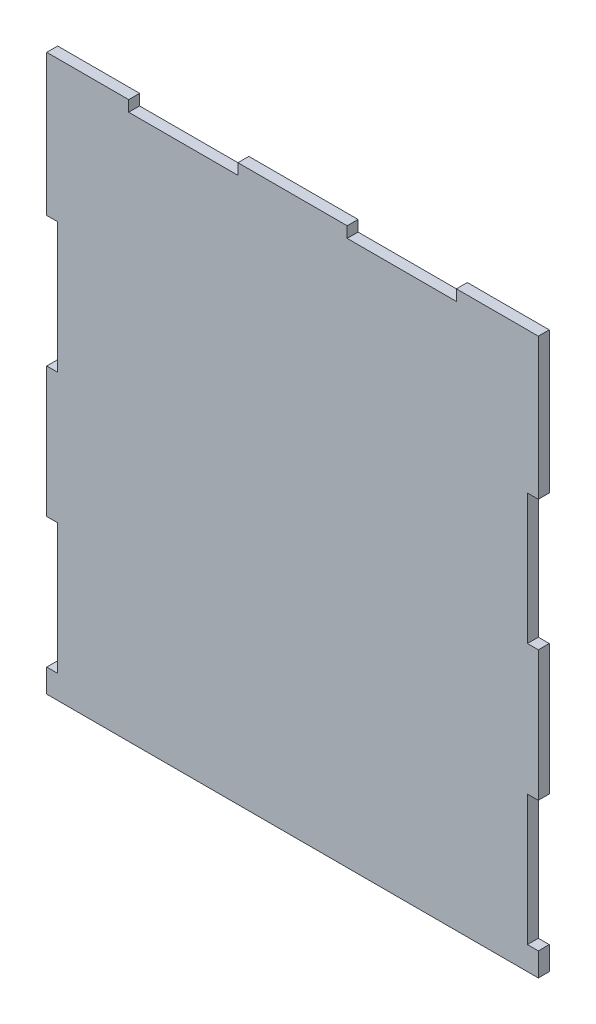
ISO-10303-21;
HEADER;
FILE_DESCRIPTION(('STEP AP214'),'2;1');
FILE_NAME('part.step','',(''),(''),'','','');
FILE_SCHEMA(('AUTOMOTIVE_DESIGN { 1 0 10303 214 1 1 1 1 }'));
ENDSEC;
DATA;
#1=APPLICATION_CONTEXT('core data for automotive mechanical design processes');
#2=APPLICATION_PROTOCOL_DEFINITION('international standard','automotive_design',2000,#1);
#3=PRODUCT_CONTEXT('',#1,'mechanical');
#4=PRODUCT('Part','Part','',(#3));
#5=PRODUCT_RELATED_PRODUCT_CATEGORY('part','',(#4));
#6=PRODUCT_DEFINITION_FORMATION('','',#4);
#7=PRODUCT_DEFINITION_CONTEXT('part definition',#1,'design');
#8=PRODUCT_DEFINITION('design','',#6,#7);
#9=PRODUCT_DEFINITION_SHAPE('','',#8);
#10=(LENGTH_UNIT() NAMED_UNIT(*) SI_UNIT(.MILLI.,.METRE.));
#11=(NAMED_UNIT(*) PLANE_ANGLE_UNIT() SI_UNIT($,.RADIAN.));
#12=(NAMED_UNIT(*) SI_UNIT($,.STERADIAN.) SOLID_ANGLE_UNIT());
#13=UNCERTAINTY_MEASURE_WITH_UNIT(LENGTH_MEASURE(1.E-05),#10,'distance_accuracy_value','');
#14=(GEOMETRIC_REPRESENTATION_CONTEXT(3) GLOBAL_UNCERTAINTY_ASSIGNED_CONTEXT((#13)) GLOBAL_UNIT_ASSIGNED_CONTEXT((#10,
#11,#12)) REPRESENTATION_CONTEXT('',''));
#15=CARTESIAN_POINT('',(0.,0.,0.));
#16=DIRECTION('',(0.,0.,1.));
#17=DIRECTION('',(1.,0.,0.));
#18=AXIS2_PLACEMENT_3D('',#15,#16,#17);
#19=CARTESIAN_POINT('',(129.,0.,3.));
#20=DIRECTION('',(0.,1.,0.));
#21=DIRECTION('',(-1.,0.,0.));
#22=AXIS2_PLACEMENT_3D('',#19,#20,#21);
#23=PLANE('',#22);
#24=DIRECTION('',(1.,0.,0.));
#25=VECTOR('',#24,1.);
#26=CARTESIAN_POINT('',(129.,0.,0.));
#27=LINE('',#26,#25);
#28=CARTESIAN_POINT('',(-2.9999999999985,0.,0.));
#29=VERTEX_POINT('',#28);
#30=CARTESIAN_POINT('',(132.000000000002,0.,0.));
#31=VERTEX_POINT('',#30);
#32=EDGE_CURVE('E146',#29,#31,#27,.T.);
#33=ORIENTED_EDGE('',*,*,#32,.T.);
#34=DIRECTION('',(0.,0.,-1.));
#35=VECTOR('',#34,1.);
#36=CARTESIAN_POINT('',(132.000000000002,0.,3.));
#37=LINE('',#36,#35);
#38=CARTESIAN_POINT('',(132.000000000002,0.,3.));
#39=VERTEX_POINT('',#38);
#40=EDGE_CURVE('E11',#39,#31,#37,.T.);
#41=ORIENTED_EDGE('',*,*,#40,.F.);
#42=DIRECTION('',(1.,0.,0.));
#43=VECTOR('',#42,1.);
#44=CARTESIAN_POINT('',(0.,0.,3.));
#45=LINE('',#44,#43);
#46=CARTESIAN_POINT('',(-2.9999999999985,0.,3.));
#47=VERTEX_POINT('',#46);
#48=EDGE_CURVE('E152',#47,#39,#45,.T.);
#49=ORIENTED_EDGE('',*,*,#48,.F.);
#50=DIRECTION('',(0.,0.,-1.));
#51=VECTOR('',#50,1.);
#52=CARTESIAN_POINT('',(-2.9999999999985,0.,3.));
#53=LINE('',#52,#51);
#54=EDGE_CURVE('E246',#47,#29,#53,.T.);
#55=ORIENTED_EDGE('',*,*,#54,.T.);
#56=EDGE_LOOP('',(#33,#41,#49,#55));
#57=FACE_BOUND('',#56,.T.);
#58=ADVANCED_FACE('F34',(#57),#23,.F.);
#59=CARTESIAN_POINT('',(132.000000000002,6.45000000000001,3.));
#60=DIRECTION('',(-1.,0.,0.));
#61=DIRECTION('',(0.,0.,1.));
#62=AXIS2_PLACEMENT_3D('',#59,#60,#61);
#63=PLANE('',#62);
#64=DIRECTION('',(0.,1.,0.));
#65=VECTOR('',#64,1.);
#66=CARTESIAN_POINT('',(132.000000000002,6.45000000000001,0.));
#67=LINE('',#66,#65);
#68=CARTESIAN_POINT('',(132.000000000002,6.45000000000001,0.));
#69=VERTEX_POINT('',#68);
#70=EDGE_CURVE('E251',#31,#69,#67,.T.);
#71=ORIENTED_EDGE('',*,*,#70,.T.);
#72=DIRECTION('',(0.,0.,-1.));
#73=VECTOR('',#72,1.);
#74=CARTESIAN_POINT('',(132.000000000002,6.45000000000001,3.));
#75=LINE('',#74,#73);
#76=CARTESIAN_POINT('',(132.000000000002,6.45000000000001,3.));
#77=VERTEX_POINT('',#76);
#78=EDGE_CURVE('E42',#77,#69,#75,.T.);
#79=ORIENTED_EDGE('',*,*,#78,.F.);
#80=DIRECTION('',(0.,1.,0.));
#81=VECTOR('',#80,1.);
#82=CARTESIAN_POINT('',(132.000000000002,6.45000000000001,3.));
#83=LINE('',#82,#81);
#84=EDGE_CURVE('E455',#39,#77,#83,.T.);
#85=ORIENTED_EDGE('',*,*,#84,.F.);
#86=ORIENTED_EDGE('',*,*,#40,.T.);
#87=EDGE_LOOP('',(#71,#79,#85,#86));
#88=FACE_BOUND('',#87,.T.);
#89=ADVANCED_FACE('F458',(#88),#63,.F.);
#90=CARTESIAN_POINT('',(129.000000000002,6.45000000000001,3.));
#91=DIRECTION('',(0.,-1.,0.));
#92=DIRECTION('',(0.,0.,-1.));
#93=AXIS2_PLACEMENT_3D('',#90,#91,#92);
#94=PLANE('',#93);
#95=DIRECTION('',(-1.,0.,0.));
#96=VECTOR('',#95,1.);
#97=CARTESIAN_POINT('',(129.000000000002,6.45000000000001,0.));
#98=LINE('',#97,#96);
#99=CARTESIAN_POINT('',(129.000000000002,6.45000000000001,0.));
#100=VERTEX_POINT('',#99);
#101=EDGE_CURVE('E253',#69,#100,#98,.T.);
#102=ORIENTED_EDGE('',*,*,#101,.T.);
#103=DIRECTION('',(0.,0.,-1.));
#104=VECTOR('',#103,1.);
#105=CARTESIAN_POINT('',(129.000000000002,6.45000000000001,3.));
#106=LINE('',#105,#104);
#107=CARTESIAN_POINT('',(129.000000000002,6.45000000000001,3.));
#108=VERTEX_POINT('',#107);
#109=EDGE_CURVE('E374',#108,#100,#106,.T.);
#110=ORIENTED_EDGE('',*,*,#109,.F.);
#111=DIRECTION('',(-1.,0.,0.));
#112=VECTOR('',#111,1.);
#113=CARTESIAN_POINT('',(129.000000000002,6.45000000000001,3.));
#114=LINE('',#113,#112);
#115=EDGE_CURVE('E383',#77,#108,#114,.T.);
#116=ORIENTED_EDGE('',*,*,#115,.F.);
#117=ORIENTED_EDGE('',*,*,#78,.T.);
#118=EDGE_LOOP('',(#102,#110,#116,#117));
#119=FACE_BOUND('',#118,.T.);
#120=ADVANCED_FACE('F381',(#119),#94,.F.);
#121=CARTESIAN_POINT('',(129.000000000002,6.45000000000001,3.));
#122=DIRECTION('',(-1.,0.,0.));
#123=DIRECTION('',(0.,-1.,0.));
#124=AXIS2_PLACEMENT_3D('',#121,#122,#123);
#125=PLANE('',#124);
#126=DIRECTION('',(0.,1.,0.));
#127=VECTOR('',#126,1.);
#128=CARTESIAN_POINT('',(129.000000000002,6.45000000000001,0.));
#129=LINE('',#128,#127);
#130=CARTESIAN_POINT('',(129.000000000001,42.25,0.));
#131=VERTEX_POINT('',#130);
#132=EDGE_CURVE('E255',#100,#131,#129,.T.);
#133=ORIENTED_EDGE('',*,*,#132,.T.);
#134=DIRECTION('',(0.,0.,-1.));
#135=VECTOR('',#134,1.);
#136=CARTESIAN_POINT('',(129.000000000001,42.25,3.));
#137=LINE('',#136,#135);
#138=CARTESIAN_POINT('',(129.000000000001,42.25,3.));
#139=VERTEX_POINT('',#138);
#140=EDGE_CURVE('E371',#139,#131,#137,.T.);
#141=ORIENTED_EDGE('',*,*,#140,.F.);
#142=DIRECTION('',(0.,1.,0.));
#143=VECTOR('',#142,1.);
#144=CARTESIAN_POINT('',(129.000000000002,6.45000000000001,3.));
#145=LINE('',#144,#143);
#146=EDGE_CURVE('E401',#108,#139,#145,.T.);
#147=ORIENTED_EDGE('',*,*,#146,.F.);
#148=ORIENTED_EDGE('',*,*,#109,.T.);
#149=EDGE_LOOP('',(#133,#141,#147,#148));
#150=FACE_BOUND('',#149,.T.);
#151=ADVANCED_FACE('F392',(#150),#125,.F.);
#152=CARTESIAN_POINT('',(132.000000000001,42.25,3.));
#153=DIRECTION('',(0.,1.,0.));
#154=DIRECTION('',(-1.,0.,0.));
#155=AXIS2_PLACEMENT_3D('',#152,#153,#154);
#156=PLANE('',#155);
#157=DIRECTION('',(1.,0.,0.));
#158=VECTOR('',#157,1.);
#159=CARTESIAN_POINT('',(132.000000000001,42.25,0.));
#160=LINE('',#159,#158);
#161=CARTESIAN_POINT('',(132.000000000001,42.25,0.));
#162=VERTEX_POINT('',#161);
#163=EDGE_CURVE('E257',#131,#162,#160,.T.);
#164=ORIENTED_EDGE('',*,*,#163,.T.);
#165=DIRECTION('',(0.,0.,-1.));
#166=VECTOR('',#165,1.);
#167=CARTESIAN_POINT('',(132.000000000001,42.25,3.));
#168=LINE('',#167,#166);
#169=CARTESIAN_POINT('',(132.000000000001,42.25,3.));
#170=VERTEX_POINT('',#169);
#171=EDGE_CURVE('E368',#170,#162,#168,.T.);
#172=ORIENTED_EDGE('',*,*,#171,.F.);
#173=DIRECTION('',(1.,0.,0.));
#174=VECTOR('',#173,1.);
#175=CARTESIAN_POINT('',(132.000000000001,42.25,3.));
#176=LINE('',#175,#174);
#177=EDGE_CURVE('E398',#139,#170,#176,.T.);
#178=ORIENTED_EDGE('',*,*,#177,.F.);
#179=ORIENTED_EDGE('',*,*,#140,.T.);
#180=EDGE_LOOP('',(#164,#172,#178,#179));
#181=FACE_BOUND('',#180,.T.);
#182=ADVANCED_FACE('F396',(#181),#156,.F.);
#183=CARTESIAN_POINT('',(132.000000000001,78.05,3.));
#184=DIRECTION('',(-1.,0.,0.));
#185=DIRECTION('',(0.,0.,1.));
#186=AXIS2_PLACEMENT_3D('',#183,#184,#185);
#187=PLANE('',#186);
#188=DIRECTION('',(0.,1.,0.));
#189=VECTOR('',#188,1.);
#190=CARTESIAN_POINT('',(132.000000000001,78.05,0.));
#191=LINE('',#190,#189);
#192=CARTESIAN_POINT('',(132.000000000001,78.05,0.));
#193=VERTEX_POINT('',#192);
#194=EDGE_CURVE('E259',#162,#193,#191,.T.);
#195=ORIENTED_EDGE('',*,*,#194,.T.);
#196=DIRECTION('',(0.,0.,-1.));
#197=VECTOR('',#196,1.);
#198=CARTESIAN_POINT('',(132.000000000001,78.05,3.));
#199=LINE('',#198,#197);
#200=CARTESIAN_POINT('',(132.000000000001,78.05,3.));
#201=VERTEX_POINT('',#200);
#202=EDGE_CURVE('E365',#201,#193,#199,.T.);
#203=ORIENTED_EDGE('',*,*,#202,.F.);
#204=DIRECTION('',(0.,1.,0.));
#205=VECTOR('',#204,1.);
#206=CARTESIAN_POINT('',(132.000000000001,78.05,3.));
#207=LINE('',#206,#205);
#208=EDGE_CURVE('E400',#170,#201,#207,.T.);
#209=ORIENTED_EDGE('',*,*,#208,.F.);
#210=ORIENTED_EDGE('',*,*,#171,.T.);
#211=EDGE_LOOP('',(#195,#203,#209,#210));
#212=FACE_BOUND('',#211,.T.);
#213=ADVANCED_FACE('F470',(#212),#187,.F.);
#214=CARTESIAN_POINT('',(129.000000000001,78.05,3.));
#215=DIRECTION('',(0.,-1.,0.));
#216=DIRECTION('',(0.,0.,-1.));
#217=AXIS2_PLACEMENT_3D('',#214,#215,#216);
#218=PLANE('',#217);
#219=DIRECTION('',(-1.,0.,0.));
#220=VECTOR('',#219,1.);
#221=CARTESIAN_POINT('',(129.000000000001,78.05,0.));
#222=LINE('',#221,#220);
#223=CARTESIAN_POINT('',(129.000000000001,78.05,0.));
#224=VERTEX_POINT('',#223);
#225=EDGE_CURVE('E261',#193,#224,#222,.T.);
#226=ORIENTED_EDGE('',*,*,#225,.T.);
#227=DIRECTION('',(0.,0.,-1.));
#228=VECTOR('',#227,1.);
#229=CARTESIAN_POINT('',(129.000000000001,78.05,3.));
#230=LINE('',#229,#228);
#231=CARTESIAN_POINT('',(129.000000000001,78.05,3.));
#232=VERTEX_POINT('',#231);
#233=EDGE_CURVE('E362',#232,#224,#230,.T.);
#234=ORIENTED_EDGE('',*,*,#233,.F.);
#235=DIRECTION('',(-1.,0.,0.));
#236=VECTOR('',#235,1.);
#237=CARTESIAN_POINT('',(129.000000000001,78.05,3.));
#238=LINE('',#237,#236);
#239=EDGE_CURVE('E403',#201,#232,#238,.T.);
#240=ORIENTED_EDGE('',*,*,#239,.F.);
#241=ORIENTED_EDGE('',*,*,#202,.T.);
#242=EDGE_LOOP('',(#226,#234,#240,#241));
#243=FACE_BOUND('',#242,.T.);
#244=ADVANCED_FACE('F473',(#243),#218,.F.);
#245=CARTESIAN_POINT('',(129.000000000001,78.05,3.));
#246=DIRECTION('',(-1.,0.,0.));
#247=DIRECTION('',(0.,-1.,0.));
#248=AXIS2_PLACEMENT_3D('',#245,#246,#247);
#249=PLANE('',#248);
#250=DIRECTION('',(0.,1.,0.));
#251=VECTOR('',#250,1.);
#252=CARTESIAN_POINT('',(129.000000000001,78.05,0.));
#253=LINE('',#252,#251);
#254=CARTESIAN_POINT('',(129.,113.85,0.));
#255=VERTEX_POINT('',#254);
#256=EDGE_CURVE('E263',#224,#255,#253,.T.);
#257=ORIENTED_EDGE('',*,*,#256,.T.);
#258=DIRECTION('',(0.,0.,-1.));
#259=VECTOR('',#258,1.);
#260=CARTESIAN_POINT('',(129.,113.85,3.));
#261=LINE('',#260,#259);
#262=CARTESIAN_POINT('',(129.,113.85,3.));
#263=VERTEX_POINT('',#262);
#264=EDGE_CURVE('E359',#263,#255,#261,.T.);
#265=ORIENTED_EDGE('',*,*,#264,.F.);
#266=DIRECTION('',(0.,1.,0.));
#267=VECTOR('',#266,1.);
#268=CARTESIAN_POINT('',(129.000000000001,78.05,3.));
#269=LINE('',#268,#267);
#270=EDGE_CURVE('E409',#232,#263,#269,.T.);
#271=ORIENTED_EDGE('',*,*,#270,.F.);
#272=ORIENTED_EDGE('',*,*,#233,.T.);
#273=EDGE_LOOP('',(#257,#265,#271,#272));
#274=FACE_BOUND('',#273,.T.);
#275=ADVANCED_FACE('F477',(#274),#249,.F.);
#276=CARTESIAN_POINT('',(132.,113.85,3.));
#277=DIRECTION('',(0.,1.,0.));
#278=DIRECTION('',(-1.,0.,0.));
#279=AXIS2_PLACEMENT_3D('',#276,#277,#278);
#280=PLANE('',#279);
#281=DIRECTION('',(1.,0.,0.));
#282=VECTOR('',#281,1.);
#283=CARTESIAN_POINT('',(132.,113.85,0.));
#284=LINE('',#283,#282);
#285=CARTESIAN_POINT('',(132.,113.85,0.));
#286=VERTEX_POINT('',#285);
#287=EDGE_CURVE('E265',#255,#286,#284,.T.);
#288=ORIENTED_EDGE('',*,*,#287,.T.);
#289=DIRECTION('',(0.,0.,-1.));
#290=VECTOR('',#289,1.);
#291=CARTESIAN_POINT('',(132.,113.85,3.));
#292=LINE('',#291,#290);
#293=CARTESIAN_POINT('',(132.,113.85,3.));
#294=VERTEX_POINT('',#293);
#295=EDGE_CURVE('E356',#294,#286,#292,.T.);
#296=ORIENTED_EDGE('',*,*,#295,.F.);
#297=DIRECTION('',(1.,0.,0.));
#298=VECTOR('',#297,1.);
#299=CARTESIAN_POINT('',(132.,113.85,3.));
#300=LINE('',#299,#298);
#301=EDGE_CURVE('E411',#263,#294,#300,.T.);
#302=ORIENTED_EDGE('',*,*,#301,.F.);
#303=ORIENTED_EDGE('',*,*,#264,.T.);
#304=EDGE_LOOP('',(#288,#296,#302,#303));
#305=FACE_BOUND('',#304,.T.);
#306=ADVANCED_FACE('F481',(#305),#280,.F.);
#307=CARTESIAN_POINT('',(132.,149.65,3.));
#308=DIRECTION('',(-1.,0.,0.));
#309=DIRECTION('',(0.,0.,1.));
#310=AXIS2_PLACEMENT_3D('',#307,#308,#309);
#311=PLANE('',#310);
#312=DIRECTION('',(0.,1.,0.));
#313=VECTOR('',#312,1.);
#314=CARTESIAN_POINT('',(132.,149.65,0.));
#315=LINE('',#314,#313);
#316=CARTESIAN_POINT('',(132.,152.65,0.));
#317=VERTEX_POINT('',#316);
#318=EDGE_CURVE('E268',#286,#317,#315,.T.);
#319=ORIENTED_EDGE('',*,*,#318,.T.);
#320=DIRECTION('',(0.,0.,-1.));
#321=VECTOR('',#320,1.);
#322=CARTESIAN_POINT('',(132.,152.65,3.));
#323=LINE('',#322,#321);
#324=CARTESIAN_POINT('',(132.,152.65,3.));
#325=VERTEX_POINT('',#324);
#326=EDGE_CURVE('E353',#325,#317,#323,.T.);
#327=ORIENTED_EDGE('',*,*,#326,.F.);
#328=DIRECTION('',(0.,1.,0.));
#329=VECTOR('',#328,1.);
#330=CARTESIAN_POINT('',(132.,149.65,3.));
#331=LINE('',#330,#329);
#332=EDGE_CURVE('E413',#294,#325,#331,.T.);
#333=ORIENTED_EDGE('',*,*,#332,.F.);
#334=ORIENTED_EDGE('',*,*,#295,.T.);
#335=EDGE_LOOP('',(#319,#327,#333,#334));
#336=FACE_BOUND('',#335,.T.);
#337=ADVANCED_FACE('F485',(#336),#311,.F.);
#338=CARTESIAN_POINT('',(129.,152.65,3.));
#339=DIRECTION('',(0.,-1.,0.));
#340=DIRECTION('',(1.,0.,0.));
#341=AXIS2_PLACEMENT_3D('',#338,#339,#340);
#342=PLANE('',#341);
#343=DIRECTION('',(-1.,0.,0.));
#344=VECTOR('',#343,1.);
#345=CARTESIAN_POINT('',(129.,152.65,0.));
#346=LINE('',#345,#344);
#347=CARTESIAN_POINT('',(109.5,152.65,0.));
#348=VERTEX_POINT('',#347);
#349=EDGE_CURVE('E271',#317,#348,#346,.T.);
#350=ORIENTED_EDGE('',*,*,#349,.T.);
#351=DIRECTION('',(0.,0.,-1.));
#352=VECTOR('',#351,1.);
#353=CARTESIAN_POINT('',(109.5,152.65,3.));
#354=LINE('',#353,#352);
#355=CARTESIAN_POINT('',(109.5,152.65,3.));
#356=VERTEX_POINT('',#355);
#357=EDGE_CURVE('E350',#356,#348,#354,.T.);
#358=ORIENTED_EDGE('',*,*,#357,.F.);
#359=DIRECTION('',(-1.,0.,0.));
#360=VECTOR('',#359,1.);
#361=CARTESIAN_POINT('',(132.,152.65,3.));
#362=LINE('',#361,#360);
#363=EDGE_CURVE('E415',#325,#356,#362,.T.);
#364=ORIENTED_EDGE('',*,*,#363,.F.);
#365=ORIENTED_EDGE('',*,*,#326,.T.);
#366=EDGE_LOOP('',(#350,#358,#364,#365));
#367=FACE_BOUND('',#366,.T.);
#368=ADVANCED_FACE('F489',(#367),#342,.F.);
#369=CARTESIAN_POINT('',(109.5,152.65,3.));
#370=DIRECTION('',(1.,0.,0.));
#371=DIRECTION('',(0.,0.,-1.));
#372=AXIS2_PLACEMENT_3D('',#369,#370,#371);
#373=PLANE('',#372);
#374=DIRECTION('',(0.,-1.,0.));
#375=VECTOR('',#374,1.);
#376=CARTESIAN_POINT('',(109.5,152.65,0.));
#377=LINE('',#376,#375);
#378=CARTESIAN_POINT('',(109.5,149.65,0.));
#379=VERTEX_POINT('',#378);
#380=EDGE_CURVE('E273',#348,#379,#377,.T.);
#381=ORIENTED_EDGE('',*,*,#380,.T.);
#382=DIRECTION('',(0.,0.,-1.));
#383=VECTOR('',#382,1.);
#384=CARTESIAN_POINT('',(109.5,149.65,3.));
#385=LINE('',#384,#383);
#386=CARTESIAN_POINT('',(109.5,149.65,3.));
#387=VERTEX_POINT('',#386);
#388=EDGE_CURVE('E347',#387,#379,#385,.T.);
#389=ORIENTED_EDGE('',*,*,#388,.F.);
#390=DIRECTION('',(0.,-1.,0.));
#391=VECTOR('',#390,1.);
#392=CARTESIAN_POINT('',(109.5,152.65,3.));
#393=LINE('',#392,#391);
#394=EDGE_CURVE('E417',#356,#387,#393,.T.);
#395=ORIENTED_EDGE('',*,*,#394,.F.);
#396=ORIENTED_EDGE('',*,*,#357,.T.);
#397=EDGE_LOOP('',(#381,#389,#395,#396));
#398=FACE_BOUND('',#397,.T.);
#399=ADVANCED_FACE('F493',(#398),#373,.F.);
#400=CARTESIAN_POINT('',(79.5,149.65,3.));
#401=DIRECTION('',(0.,-1.,0.));
#402=DIRECTION('',(0.,0.,-1.));
#403=AXIS2_PLACEMENT_3D('',#400,#401,#402);
#404=PLANE('',#403);
#405=DIRECTION('',(-1.,0.,0.));
#406=VECTOR('',#405,1.);
#407=CARTESIAN_POINT('',(79.5,149.65,0.));
#408=LINE('',#407,#406);
#409=CARTESIAN_POINT('',(79.5,149.65,0.));
#410=VERTEX_POINT('',#409);
#411=EDGE_CURVE('E275',#379,#410,#408,.T.);
#412=ORIENTED_EDGE('',*,*,#411,.T.);
#413=DIRECTION('',(0.,0.,-1.));
#414=VECTOR('',#413,1.);
#415=CARTESIAN_POINT('',(79.5,149.65,3.));
#416=LINE('',#415,#414);
#417=CARTESIAN_POINT('',(79.5,149.65,3.));
#418=VERTEX_POINT('',#417);
#419=EDGE_CURVE('E344',#418,#410,#416,.T.);
#420=ORIENTED_EDGE('',*,*,#419,.F.);
#421=DIRECTION('',(-1.,0.,0.));
#422=VECTOR('',#421,1.);
#423=CARTESIAN_POINT('',(79.5,149.65,3.));
#424=LINE('',#423,#422);
#425=EDGE_CURVE('E419',#387,#418,#424,.T.);
#426=ORIENTED_EDGE('',*,*,#425,.F.);
#427=ORIENTED_EDGE('',*,*,#388,.T.);
#428=EDGE_LOOP('',(#412,#420,#426,#427));
#429=FACE_BOUND('',#428,.T.);
#430=ADVANCED_FACE('F497',(#429),#404,.F.);
#431=CARTESIAN_POINT('',(79.5,152.65,3.));
#432=DIRECTION('',(-1.,0.,0.));
#433=DIRECTION('',(0.,0.,1.));
#434=AXIS2_PLACEMENT_3D('',#431,#432,#433);
#435=PLANE('',#434);
#436=DIRECTION('',(0.,1.,0.));
#437=VECTOR('',#436,1.);
#438=CARTESIAN_POINT('',(79.5,152.65,0.));
#439=LINE('',#438,#437);
#440=CARTESIAN_POINT('',(79.5,152.65,0.));
#441=VERTEX_POINT('',#440);
#442=EDGE_CURVE('E277',#410,#441,#439,.T.);
#443=ORIENTED_EDGE('',*,*,#442,.T.);
#444=DIRECTION('',(0.,0.,-1.));
#445=VECTOR('',#444,1.);
#446=CARTESIAN_POINT('',(79.5,152.65,3.));
#447=LINE('',#446,#445);
#448=CARTESIAN_POINT('',(79.5,152.65,3.));
#449=VERTEX_POINT('',#448);
#450=EDGE_CURVE('E341',#449,#441,#447,.T.);
#451=ORIENTED_EDGE('',*,*,#450,.F.);
#452=DIRECTION('',(0.,1.,0.));
#453=VECTOR('',#452,1.);
#454=CARTESIAN_POINT('',(79.5,152.65,3.));
#455=LINE('',#454,#453);
#456=EDGE_CURVE('E421',#418,#449,#455,.T.);
#457=ORIENTED_EDGE('',*,*,#456,.F.);
#458=ORIENTED_EDGE('',*,*,#419,.T.);
#459=EDGE_LOOP('',(#443,#451,#457,#458));
#460=FACE_BOUND('',#459,.T.);
#461=ADVANCED_FACE('F501',(#460),#435,.F.);
#462=CARTESIAN_POINT('',(49.5,152.65,3.));
#463=DIRECTION('',(0.,-1.,0.));
#464=DIRECTION('',(0.,0.,-1.));
#465=AXIS2_PLACEMENT_3D('',#462,#463,#464);
#466=PLANE('',#465);
#467=DIRECTION('',(-1.,0.,0.));
#468=VECTOR('',#467,1.);
#469=CARTESIAN_POINT('',(49.5,152.65,0.));
#470=LINE('',#469,#468);
#471=CARTESIAN_POINT('',(49.5,152.65,0.));
#472=VERTEX_POINT('',#471);
#473=EDGE_CURVE('E279',#441,#472,#470,.T.);
#474=ORIENTED_EDGE('',*,*,#473,.T.);
#475=DIRECTION('',(0.,0.,-1.));
#476=VECTOR('',#475,1.);
#477=CARTESIAN_POINT('',(49.5,152.65,3.));
#478=LINE('',#477,#476);
#479=CARTESIAN_POINT('',(49.5,152.65,3.));
#480=VERTEX_POINT('',#479);
#481=EDGE_CURVE('E338',#480,#472,#478,.T.);
#482=ORIENTED_EDGE('',*,*,#481,.F.);
#483=DIRECTION('',(-1.,0.,0.));
#484=VECTOR('',#483,1.);
#485=CARTESIAN_POINT('',(49.5,152.65,3.));
#486=LINE('',#485,#484);
#487=EDGE_CURVE('E423',#449,#480,#486,.T.);
#488=ORIENTED_EDGE('',*,*,#487,.F.);
#489=ORIENTED_EDGE('',*,*,#450,.T.);
#490=EDGE_LOOP('',(#474,#482,#488,#489));
#491=FACE_BOUND('',#490,.T.);
#492=ADVANCED_FACE('F505',(#491),#466,.F.);
#493=CARTESIAN_POINT('',(49.5,149.65,3.));
#494=DIRECTION('',(1.,0.,0.));
#495=DIRECTION('',(0.,0.,-1.));
#496=AXIS2_PLACEMENT_3D('',#493,#494,#495);
#497=PLANE('',#496);
#498=DIRECTION('',(0.,-1.,0.));
#499=VECTOR('',#498,1.);
#500=CARTESIAN_POINT('',(49.5,149.65,0.));
#501=LINE('',#500,#499);
#502=CARTESIAN_POINT('',(49.5,149.65,0.));
#503=VERTEX_POINT('',#502);
#504=EDGE_CURVE('E281',#472,#503,#501,.T.);
#505=ORIENTED_EDGE('',*,*,#504,.T.);
#506=DIRECTION('',(0.,0.,-1.));
#507=VECTOR('',#506,1.);
#508=CARTESIAN_POINT('',(49.5,149.65,3.));
#509=LINE('',#508,#507);
#510=CARTESIAN_POINT('',(49.5,149.65,3.));
#511=VERTEX_POINT('',#510);
#512=EDGE_CURVE('E335',#511,#503,#509,.T.);
#513=ORIENTED_EDGE('',*,*,#512,.F.);
#514=DIRECTION('',(0.,-1.,0.));
#515=VECTOR('',#514,1.);
#516=CARTESIAN_POINT('',(49.5,149.65,3.));
#517=LINE('',#516,#515);
#518=EDGE_CURVE('E425',#480,#511,#517,.T.);
#519=ORIENTED_EDGE('',*,*,#518,.F.);
#520=ORIENTED_EDGE('',*,*,#481,.T.);
#521=EDGE_LOOP('',(#505,#513,#519,#520));
#522=FACE_BOUND('',#521,.T.);
#523=ADVANCED_FACE('F509',(#522),#497,.F.);
#524=CARTESIAN_POINT('',(19.5,149.65,3.));
#525=DIRECTION('',(0.,-1.,0.));
#526=DIRECTION('',(0.,0.,-1.));
#527=AXIS2_PLACEMENT_3D('',#524,#525,#526);
#528=PLANE('',#527);
#529=DIRECTION('',(-1.,0.,0.));
#530=VECTOR('',#529,1.);
#531=CARTESIAN_POINT('',(19.5,149.65,0.));
#532=LINE('',#531,#530);
#533=CARTESIAN_POINT('',(19.5,149.65,0.));
#534=VERTEX_POINT('',#533);
#535=EDGE_CURVE('E283',#503,#534,#532,.T.);
#536=ORIENTED_EDGE('',*,*,#535,.T.);
#537=DIRECTION('',(0.,0.,-1.));
#538=VECTOR('',#537,1.);
#539=CARTESIAN_POINT('',(19.5,149.65,3.));
#540=LINE('',#539,#538);
#541=CARTESIAN_POINT('',(19.5,149.65,3.));
#542=VERTEX_POINT('',#541);
#543=EDGE_CURVE('E332',#542,#534,#540,.T.);
#544=ORIENTED_EDGE('',*,*,#543,.F.);
#545=DIRECTION('',(-1.,0.,0.));
#546=VECTOR('',#545,1.);
#547=CARTESIAN_POINT('',(19.5,149.65,3.));
#548=LINE('',#547,#546);
#549=EDGE_CURVE('E427',#511,#542,#548,.T.);
#550=ORIENTED_EDGE('',*,*,#549,.F.);
#551=ORIENTED_EDGE('',*,*,#512,.T.);
#552=EDGE_LOOP('',(#536,#544,#550,#551));
#553=FACE_BOUND('',#552,.T.);
#554=ADVANCED_FACE('F513',(#553),#528,.F.);
#555=CARTESIAN_POINT('',(19.5,152.65,3.));
#556=DIRECTION('',(-1.,0.,0.));
#557=DIRECTION('',(0.,0.,1.));
#558=AXIS2_PLACEMENT_3D('',#555,#556,#557);
#559=PLANE('',#558);
#560=DIRECTION('',(0.,1.,0.));
#561=VECTOR('',#560,1.);
#562=CARTESIAN_POINT('',(19.5,152.65,0.));
#563=LINE('',#562,#561);
#564=CARTESIAN_POINT('',(19.5,152.65,0.));
#565=VERTEX_POINT('',#564);
#566=EDGE_CURVE('E285',#534,#565,#563,.T.);
#567=ORIENTED_EDGE('',*,*,#566,.T.);
#568=DIRECTION('',(0.,0.,-1.));
#569=VECTOR('',#568,1.);
#570=CARTESIAN_POINT('',(19.5,152.65,3.));
#571=LINE('',#570,#569);
#572=CARTESIAN_POINT('',(19.5,152.65,3.));
#573=VERTEX_POINT('',#572);
#574=EDGE_CURVE('E329',#573,#565,#571,.T.);
#575=ORIENTED_EDGE('',*,*,#574,.F.);
#576=DIRECTION('',(0.,1.,0.));
#577=VECTOR('',#576,1.);
#578=CARTESIAN_POINT('',(19.5,152.65,3.));
#579=LINE('',#578,#577);
#580=EDGE_CURVE('E429',#542,#573,#579,.T.);
#581=ORIENTED_EDGE('',*,*,#580,.F.);
#582=ORIENTED_EDGE('',*,*,#543,.T.);
#583=EDGE_LOOP('',(#567,#575,#581,#582));
#584=FACE_BOUND('',#583,.T.);
#585=ADVANCED_FACE('F517',(#584),#559,.F.);
#586=CARTESIAN_POINT('',(0.,152.65,3.));
#587=DIRECTION('',(0.,-1.,0.));
#588=DIRECTION('',(0.,0.,-1.));
#589=AXIS2_PLACEMENT_3D('',#586,#587,#588);
#590=PLANE('',#589);
#591=DIRECTION('',(-1.,0.,0.));
#592=VECTOR('',#591,1.);
#593=CARTESIAN_POINT('',(0.,152.65,0.));
#594=LINE('',#593,#592);
#595=CARTESIAN_POINT('',(-3.,152.65,0.));
#596=VERTEX_POINT('',#595);
#597=EDGE_CURVE('E288',#565,#596,#594,.T.);
#598=ORIENTED_EDGE('',*,*,#597,.T.);
#599=DIRECTION('',(0.,0.,-1.));
#600=VECTOR('',#599,1.);
#601=CARTESIAN_POINT('',(-3.,152.65,3.));
#602=LINE('',#601,#600);
#603=CARTESIAN_POINT('',(-3.,152.65,3.));
#604=VERTEX_POINT('',#603);
#605=EDGE_CURVE('E326',#604,#596,#602,.T.);
#606=ORIENTED_EDGE('',*,*,#605,.F.);
#607=DIRECTION('',(-1.,0.,0.));
#608=VECTOR('',#607,1.);
#609=CARTESIAN_POINT('',(0.,152.65,3.));
#610=LINE('',#609,#608);
#611=EDGE_CURVE('E431',#573,#604,#610,.T.);
#612=ORIENTED_EDGE('',*,*,#611,.F.);
#613=ORIENTED_EDGE('',*,*,#574,.T.);
#614=EDGE_LOOP('',(#598,#606,#612,#613));
#615=FACE_BOUND('',#614,.T.);
#616=ADVANCED_FACE('F521',(#615),#590,.F.);
#617=CARTESIAN_POINT('',(-3.,149.65,3.));
#618=DIRECTION('',(1.,0.,0.));
#619=DIRECTION('',(0.,1.,0.));
#620=AXIS2_PLACEMENT_3D('',#617,#618,#619);
#621=PLANE('',#620);
#622=DIRECTION('',(0.,-1.,0.));
#623=VECTOR('',#622,1.);
#624=CARTESIAN_POINT('',(-3.,149.65,0.));
#625=LINE('',#624,#623);
#626=CARTESIAN_POINT('',(-3.,113.85,0.));
#627=VERTEX_POINT('',#626);
#628=EDGE_CURVE('E291',#596,#627,#625,.T.);
#629=ORIENTED_EDGE('',*,*,#628,.T.);
#630=DIRECTION('',(0.,0.,-1.));
#631=VECTOR('',#630,1.);
#632=CARTESIAN_POINT('',(-3.,113.85,3.));
#633=LINE('',#632,#631);
#634=CARTESIAN_POINT('',(-3.,113.85,3.));
#635=VERTEX_POINT('',#634);
#636=EDGE_CURVE('E323',#635,#627,#633,.T.);
#637=ORIENTED_EDGE('',*,*,#636,.F.);
#638=DIRECTION('',(0.,-1.,0.));
#639=VECTOR('',#638,1.);
#640=CARTESIAN_POINT('',(-3.,152.65,3.));
#641=LINE('',#640,#639);
#642=EDGE_CURVE('E433',#604,#635,#641,.T.);
#643=ORIENTED_EDGE('',*,*,#642,.F.);
#644=ORIENTED_EDGE('',*,*,#605,.T.);
#645=EDGE_LOOP('',(#629,#637,#643,#644));
#646=FACE_BOUND('',#645,.T.);
#647=ADVANCED_FACE('F525',(#646),#621,.F.);
#648=CARTESIAN_POINT('',(-3.,113.85,3.));
#649=DIRECTION('',(0.,1.,0.));
#650=DIRECTION('',(0.,0.,1.));
#651=AXIS2_PLACEMENT_3D('',#648,#649,#650);
#652=PLANE('',#651);
#653=DIRECTION('',(1.,0.,0.));
#654=VECTOR('',#653,1.);
#655=CARTESIAN_POINT('',(-3.,113.85,0.));
#656=LINE('',#655,#654);
#657=CARTESIAN_POINT('',(0.,113.85,0.));
#658=VERTEX_POINT('',#657);
#659=EDGE_CURVE('E293',#627,#658,#656,.T.);
#660=ORIENTED_EDGE('',*,*,#659,.T.);
#661=DIRECTION('',(0.,0.,-1.));
#662=VECTOR('',#661,1.);
#663=CARTESIAN_POINT('',(0.,113.85,3.));
#664=LINE('',#663,#662);
#665=CARTESIAN_POINT('',(0.,113.85,3.));
#666=VERTEX_POINT('',#665);
#667=EDGE_CURVE('E320',#666,#658,#664,.T.);
#668=ORIENTED_EDGE('',*,*,#667,.F.);
#669=DIRECTION('',(1.,0.,0.));
#670=VECTOR('',#669,1.);
#671=CARTESIAN_POINT('',(-3.,113.85,3.));
#672=LINE('',#671,#670);
#673=EDGE_CURVE('E435',#635,#666,#672,.T.);
#674=ORIENTED_EDGE('',*,*,#673,.F.);
#675=ORIENTED_EDGE('',*,*,#636,.T.);
#676=EDGE_LOOP('',(#660,#668,#674,#675));
#677=FACE_BOUND('',#676,.T.);
#678=ADVANCED_FACE('F529',(#677),#652,.F.);
#679=CARTESIAN_POINT('',(7.49970191583505E-13,78.05,3.));
#680=DIRECTION('',(1.,0.,0.));
#681=DIRECTION('',(0.,1.,0.));
#682=AXIS2_PLACEMENT_3D('',#679,#680,#681);
#683=PLANE('',#682);
#684=DIRECTION('',(0.,-1.,0.));
#685=VECTOR('',#684,1.);
#686=CARTESIAN_POINT('',(7.49970191583505E-13,78.05,0.));
#687=LINE('',#686,#685);
#688=CARTESIAN_POINT('',(7.49970191583505E-13,78.05,0.));
#689=VERTEX_POINT('',#688);
#690=EDGE_CURVE('E295',#658,#689,#687,.T.);
#691=ORIENTED_EDGE('',*,*,#690,.T.);
#692=DIRECTION('',(0.,0.,-1.));
#693=VECTOR('',#692,1.);
#694=CARTESIAN_POINT('',(7.49970191583505E-13,78.05,3.));
#695=LINE('',#694,#693);
#696=CARTESIAN_POINT('',(7.49970191583505E-13,78.05,3.));
#697=VERTEX_POINT('',#696);
#698=EDGE_CURVE('E317',#697,#689,#695,.T.);
#699=ORIENTED_EDGE('',*,*,#698,.F.);
#700=DIRECTION('',(0.,-1.,0.));
#701=VECTOR('',#700,1.);
#702=CARTESIAN_POINT('',(7.49970191583505E-13,78.05,3.));
#703=LINE('',#702,#701);
#704=EDGE_CURVE('E437',#666,#697,#703,.T.);
#705=ORIENTED_EDGE('',*,*,#704,.F.);
#706=ORIENTED_EDGE('',*,*,#667,.T.);
#707=EDGE_LOOP('',(#691,#699,#705,#706));
#708=FACE_BOUND('',#707,.T.);
#709=ADVANCED_FACE('F533',(#708),#683,.F.);
#710=CARTESIAN_POINT('',(7.49970191583505E-13,78.05,3.));
#711=DIRECTION('',(0.,-1.,0.));
#712=DIRECTION('',(0.,0.,-1.));
#713=AXIS2_PLACEMENT_3D('',#710,#711,#712);
#714=PLANE('',#713);
#715=DIRECTION('',(-1.,0.,0.));
#716=VECTOR('',#715,1.);
#717=CARTESIAN_POINT('',(7.49970191583505E-13,78.05,0.));
#718=LINE('',#717,#716);
#719=CARTESIAN_POINT('',(-2.99999999999925,78.05,0.));
#720=VERTEX_POINT('',#719);
#721=EDGE_CURVE('E297',#689,#720,#718,.T.);
#722=ORIENTED_EDGE('',*,*,#721,.T.);
#723=DIRECTION('',(0.,0.,-1.));
#724=VECTOR('',#723,1.);
#725=CARTESIAN_POINT('',(-2.99999999999925,78.05,3.));
#726=LINE('',#725,#724);
#727=CARTESIAN_POINT('',(-2.99999999999925,78.05,3.));
#728=VERTEX_POINT('',#727);
#729=EDGE_CURVE('E314',#728,#720,#726,.T.);
#730=ORIENTED_EDGE('',*,*,#729,.F.);
#731=DIRECTION('',(-1.,0.,0.));
#732=VECTOR('',#731,1.);
#733=CARTESIAN_POINT('',(7.49970191583505E-13,78.05,3.));
#734=LINE('',#733,#732);
#735=EDGE_CURVE('E439',#697,#728,#734,.T.);
#736=ORIENTED_EDGE('',*,*,#735,.F.);
#737=ORIENTED_EDGE('',*,*,#698,.T.);
#738=EDGE_LOOP('',(#722,#730,#736,#737));
#739=FACE_BOUND('',#738,.T.);
#740=ADVANCED_FACE('F537',(#739),#714,.F.);
#741=CARTESIAN_POINT('',(-2.99999999999925,78.05,3.));
#742=DIRECTION('',(1.,0.,0.));
#743=DIRECTION('',(0.,1.,0.));
#744=AXIS2_PLACEMENT_3D('',#741,#742,#743);
#745=PLANE('',#744);
#746=DIRECTION('',(0.,-1.,0.));
#747=VECTOR('',#746,1.);
#748=CARTESIAN_POINT('',(-2.99999999999925,78.05,0.));
#749=LINE('',#748,#747);
#750=CARTESIAN_POINT('',(-2.99999999999925,42.25,0.));
#751=VERTEX_POINT('',#750);
#752=EDGE_CURVE('E299',#720,#751,#749,.T.);
#753=ORIENTED_EDGE('',*,*,#752,.T.);
#754=DIRECTION('',(0.,0.,-1.));
#755=VECTOR('',#754,1.);
#756=CARTESIAN_POINT('',(-2.99999999999925,42.25,3.));
#757=LINE('',#756,#755);
#758=CARTESIAN_POINT('',(-2.99999999999925,42.25,3.));
#759=VERTEX_POINT('',#758);
#760=EDGE_CURVE('E311',#759,#751,#757,.T.);
#761=ORIENTED_EDGE('',*,*,#760,.F.);
#762=DIRECTION('',(0.,-1.,0.));
#763=VECTOR('',#762,1.);
#764=CARTESIAN_POINT('',(-2.99999999999925,78.05,3.));
#765=LINE('',#764,#763);
#766=EDGE_CURVE('E441',#728,#759,#765,.T.);
#767=ORIENTED_EDGE('',*,*,#766,.F.);
#768=ORIENTED_EDGE('',*,*,#729,.T.);
#769=EDGE_LOOP('',(#753,#761,#767,#768));
#770=FACE_BOUND('',#769,.T.);
#771=ADVANCED_FACE('F447',(#770),#745,.F.);
#772=CARTESIAN_POINT('',(-2.99999999999925,42.25,3.));
#773=DIRECTION('',(0.,1.,0.));
#774=DIRECTION('',(0.,0.,1.));
#775=AXIS2_PLACEMENT_3D('',#772,#773,#774);
#776=PLANE('',#775);
#777=DIRECTION('',(1.,0.,0.));
#778=VECTOR('',#777,1.);
#779=CARTESIAN_POINT('',(-2.99999999999925,42.25,0.));
#780=LINE('',#779,#778);
#781=CARTESIAN_POINT('',(7.49970191583505E-13,42.25,0.));
#782=VERTEX_POINT('',#781);
#783=EDGE_CURVE('E301',#751,#782,#780,.T.);
#784=ORIENTED_EDGE('',*,*,#783,.T.);
#785=DIRECTION('',(0.,0.,-1.));
#786=VECTOR('',#785,1.);
#787=CARTESIAN_POINT('',(7.49970191583505E-13,42.25,3.));
#788=LINE('',#787,#786);
#789=CARTESIAN_POINT('',(7.49970191583505E-13,42.25,3.));
#790=VERTEX_POINT('',#789);
#791=EDGE_CURVE('E241',#790,#782,#788,.T.);
#792=ORIENTED_EDGE('',*,*,#791,.F.);
#793=DIRECTION('',(1.,0.,0.));
#794=VECTOR('',#793,1.);
#795=CARTESIAN_POINT('',(-2.99999999999925,42.25,3.));
#796=LINE('',#795,#794);
#797=EDGE_CURVE('E232',#759,#790,#796,.T.);
#798=ORIENTED_EDGE('',*,*,#797,.F.);
#799=ORIENTED_EDGE('',*,*,#760,.T.);
#800=EDGE_LOOP('',(#784,#792,#798,#799));
#801=FACE_BOUND('',#800,.T.);
#802=ADVANCED_FACE('F451',(#801),#776,.F.);
#803=CARTESIAN_POINT('',(1.49994038316701E-12,6.45000000000001,3.));
#804=DIRECTION('',(1.,0.,0.));
#805=DIRECTION('',(0.,1.,0.));
#806=AXIS2_PLACEMENT_3D('',#803,#804,#805);
#807=PLANE('',#806);
#808=DIRECTION('',(0.,-1.,0.));
#809=VECTOR('',#808,1.);
#810=CARTESIAN_POINT('',(1.49994038316701E-12,6.45000000000001,0.));
#811=LINE('',#810,#809);
#812=CARTESIAN_POINT('',(1.49994038316701E-12,6.45000000000001,0.));
#813=VERTEX_POINT('',#812);
#814=EDGE_CURVE('E240',#782,#813,#811,.T.);
#815=ORIENTED_EDGE('',*,*,#814,.T.);
#816=DIRECTION('',(0.,0.,-1.));
#817=VECTOR('',#816,1.);
#818=CARTESIAN_POINT('',(1.49994038316701E-12,6.45000000000001,3.));
#819=LINE('',#818,#817);
#820=CARTESIAN_POINT('',(1.49994038316701E-12,6.45000000000001,3.));
#821=VERTEX_POINT('',#820);
#822=EDGE_CURVE('E237',#821,#813,#819,.T.);
#823=ORIENTED_EDGE('',*,*,#822,.F.);
#824=DIRECTION('',(0.,-1.,0.));
#825=VECTOR('',#824,1.);
#826=CARTESIAN_POINT('',(1.49994038316701E-12,6.45000000000001,3.));
#827=LINE('',#826,#825);
#828=EDGE_CURVE('E226',#790,#821,#827,.T.);
#829=ORIENTED_EDGE('',*,*,#828,.F.);
#830=ORIENTED_EDGE('',*,*,#791,.T.);
#831=EDGE_LOOP('',(#815,#823,#829,#830));
#832=FACE_BOUND('',#831,.T.);
#833=ADVANCED_FACE('F238',(#832),#807,.F.);
#834=CARTESIAN_POINT('',(1.49994038316701E-12,6.45000000000001,3.));
#835=DIRECTION('',(0.,-1.,0.));
#836=DIRECTION('',(0.,0.,-1.));
#837=AXIS2_PLACEMENT_3D('',#834,#835,#836);
#838=PLANE('',#837);
#839=DIRECTION('',(-1.,0.,0.));
#840=VECTOR('',#839,1.);
#841=CARTESIAN_POINT('',(1.49994038316701E-12,6.45000000000001,0.));
#842=LINE('',#841,#840);
#843=CARTESIAN_POINT('',(-2.9999999999985,6.45000000000001,0.));
#844=VERTEX_POINT('',#843);
#845=EDGE_CURVE('E139',#813,#844,#842,.T.);
#846=ORIENTED_EDGE('',*,*,#845,.T.);
#847=DIRECTION('',(0.,0.,-1.));
#848=VECTOR('',#847,1.);
#849=CARTESIAN_POINT('',(-2.9999999999985,6.45000000000001,3.));
#850=LINE('',#849,#848);
#851=CARTESIAN_POINT('',(-2.9999999999985,6.45000000000001,3.));
#852=VERTEX_POINT('',#851);
#853=EDGE_CURVE('E242',#852,#844,#850,.T.);
#854=ORIENTED_EDGE('',*,*,#853,.F.);
#855=DIRECTION('',(-1.,0.,0.));
#856=VECTOR('',#855,1.);
#857=CARTESIAN_POINT('',(1.49994038316701E-12,6.45000000000001,3.));
#858=LINE('',#857,#856);
#859=EDGE_CURVE('E230',#821,#852,#858,.T.);
#860=ORIENTED_EDGE('',*,*,#859,.F.);
#861=ORIENTED_EDGE('',*,*,#822,.T.);
#862=EDGE_LOOP('',(#846,#854,#860,#861));
#863=FACE_BOUND('',#862,.T.);
#864=ADVANCED_FACE('F244',(#863),#838,.F.);
#865=CARTESIAN_POINT('',(-2.9999999999985,6.45000000000001,3.));
#866=DIRECTION('',(1.,0.,0.));
#867=DIRECTION('',(0.,1.,0.));
#868=AXIS2_PLACEMENT_3D('',#865,#866,#867);
#869=PLANE('',#868);
#870=DIRECTION('',(0.,-1.,0.));
#871=VECTOR('',#870,1.);
#872=CARTESIAN_POINT('',(-2.9999999999985,6.45000000000001,0.));
#873=LINE('',#872,#871);
#874=EDGE_CURVE('E305',#844,#29,#873,.T.);
#875=ORIENTED_EDGE('',*,*,#874,.T.);
#876=ORIENTED_EDGE('',*,*,#54,.F.);
#877=DIRECTION('',(0.,-1.,0.));
#878=VECTOR('',#877,1.);
#879=CARTESIAN_POINT('',(-2.9999999999985,6.45000000000001,3.));
#880=LINE('',#879,#878);
#881=EDGE_CURVE('E50',#852,#47,#880,.T.);
#882=ORIENTED_EDGE('',*,*,#881,.F.);
#883=ORIENTED_EDGE('',*,*,#853,.T.);
#884=EDGE_LOOP('',(#875,#876,#882,#883));
#885=FACE_BOUND('',#884,.T.);
#886=ADVANCED_FACE('F453',(#885),#869,.F.);
#887=CARTESIAN_POINT('',(0.,0.,3.));
#888=DIRECTION('',(0.,0.,1.));
#889=DIRECTION('',(1.,0.,0.));
#890=AXIS2_PLACEMENT_3D('',#887,#888,#889);
#891=PLANE('',#890);
#892=ORIENTED_EDGE('',*,*,#48,.T.);
#893=ORIENTED_EDGE('',*,*,#84,.T.);
#894=ORIENTED_EDGE('',*,*,#115,.T.);
#895=ORIENTED_EDGE('',*,*,#146,.T.);
#896=ORIENTED_EDGE('',*,*,#177,.T.);
#897=ORIENTED_EDGE('',*,*,#208,.T.);
#898=ORIENTED_EDGE('',*,*,#239,.T.);
#899=ORIENTED_EDGE('',*,*,#270,.T.);
#900=ORIENTED_EDGE('',*,*,#301,.T.);
#901=ORIENTED_EDGE('',*,*,#332,.T.);
#902=ORIENTED_EDGE('',*,*,#363,.T.);
#903=ORIENTED_EDGE('',*,*,#394,.T.);
#904=ORIENTED_EDGE('',*,*,#425,.T.);
#905=ORIENTED_EDGE('',*,*,#456,.T.);
#906=ORIENTED_EDGE('',*,*,#487,.T.);
#907=ORIENTED_EDGE('',*,*,#518,.T.);
#908=ORIENTED_EDGE('',*,*,#549,.T.);
#909=ORIENTED_EDGE('',*,*,#580,.T.);
#910=ORIENTED_EDGE('',*,*,#611,.T.);
#911=ORIENTED_EDGE('',*,*,#642,.T.);
#912=ORIENTED_EDGE('',*,*,#673,.T.);
#913=ORIENTED_EDGE('',*,*,#704,.T.);
#914=ORIENTED_EDGE('',*,*,#735,.T.);
#915=ORIENTED_EDGE('',*,*,#766,.T.);
#916=ORIENTED_EDGE('',*,*,#797,.T.);
#917=ORIENTED_EDGE('',*,*,#828,.T.);
#918=ORIENTED_EDGE('',*,*,#859,.T.);
#919=ORIENTED_EDGE('',*,*,#881,.T.);
#920=EDGE_LOOP('',(#892,#893,#894,#895,#896,#897,#898,#899,#900,#901,#902,#903,#904,#905,#906,
#907,#908,#909,#910,#911,#912,#913,#914,#915,#916,#917,#918,#919));
#921=FACE_BOUND('',#920,.T.);
#922=ADVANCED_FACE('F228',(#921),#891,.T.);
#923=CARTESIAN_POINT('',(0.,0.,0.));
#924=DIRECTION('',(0.,0.,1.));
#925=DIRECTION('',(1.,0.,0.));
#926=AXIS2_PLACEMENT_3D('',#923,#924,#925);
#927=PLANE('',#926);
#928=ORIENTED_EDGE('',*,*,#32,.F.);
#929=ORIENTED_EDGE('',*,*,#874,.F.);
#930=ORIENTED_EDGE('',*,*,#845,.F.);
#931=ORIENTED_EDGE('',*,*,#814,.F.);
#932=ORIENTED_EDGE('',*,*,#783,.F.);
#933=ORIENTED_EDGE('',*,*,#752,.F.);
#934=ORIENTED_EDGE('',*,*,#721,.F.);
#935=ORIENTED_EDGE('',*,*,#690,.F.);
#936=ORIENTED_EDGE('',*,*,#659,.F.);
#937=ORIENTED_EDGE('',*,*,#628,.F.);
#938=ORIENTED_EDGE('',*,*,#597,.F.);
#939=ORIENTED_EDGE('',*,*,#566,.F.);
#940=ORIENTED_EDGE('',*,*,#535,.F.);
#941=ORIENTED_EDGE('',*,*,#504,.F.);
#942=ORIENTED_EDGE('',*,*,#473,.F.);
#943=ORIENTED_EDGE('',*,*,#442,.F.);
#944=ORIENTED_EDGE('',*,*,#411,.F.);
#945=ORIENTED_EDGE('',*,*,#380,.F.);
#946=ORIENTED_EDGE('',*,*,#349,.F.);
#947=ORIENTED_EDGE('',*,*,#318,.F.);
#948=ORIENTED_EDGE('',*,*,#287,.F.);
#949=ORIENTED_EDGE('',*,*,#256,.F.);
#950=ORIENTED_EDGE('',*,*,#225,.F.);
#951=ORIENTED_EDGE('',*,*,#194,.F.);
#952=ORIENTED_EDGE('',*,*,#163,.F.);
#953=ORIENTED_EDGE('',*,*,#132,.F.);
#954=ORIENTED_EDGE('',*,*,#101,.F.);
#955=ORIENTED_EDGE('',*,*,#70,.F.);
#956=EDGE_LOOP('',(#928,#929,#930,#931,#932,#933,#934,#935,#936,#937,#938,#939,#940,#941,#942,
#943,#944,#945,#946,#947,#948,#949,#950,#951,#952,#953,#954,#955));
#957=FACE_BOUND('',#956,.T.);
#958=ADVANCED_FACE('F387',(#957),#927,.F.);
#959=CLOSED_SHELL('',(#58,#89,#120,#151,#182,#213,#244,#275,#306,#337,#368,#399,#430,#461,#492,
#523,#554,#585,#616,#647,#678,#709,#740,#771,#802,#833,#864,#886,#922,#958));
#960=MANIFOLD_SOLID_BREP('B2',#959);
#961=ADVANCED_BREP_SHAPE_REPRESENTATION('',(#18,#960),#14);
#962=SHAPE_DEFINITION_REPRESENTATION(#9,#961);
ENDSEC;
END-ISO-10303-21;
